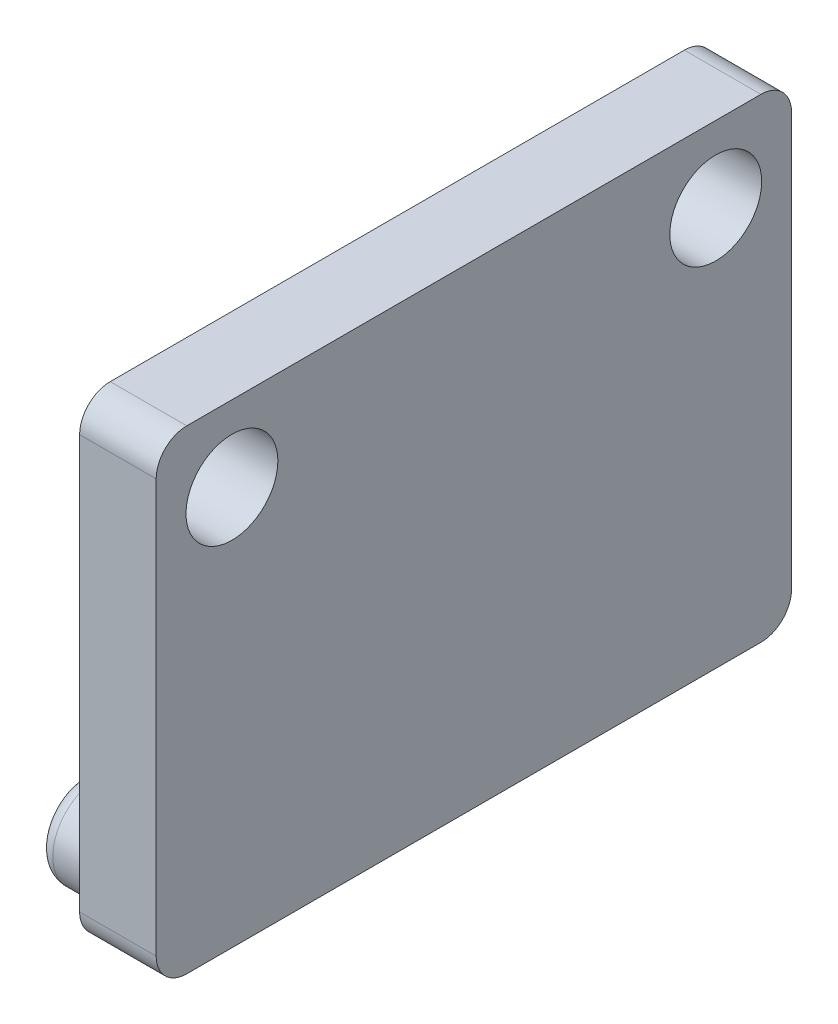
ISO-10303-21;
HEADER;
FILE_DESCRIPTION(('STEP AP214'),'2;1');
FILE_NAME('part.step','',(''),(''),'','','');
FILE_SCHEMA(('AUTOMOTIVE_DESIGN { 1 0 10303 214 1 1 1 1 }'));
ENDSEC;
DATA;
#1=APPLICATION_CONTEXT('core data for automotive mechanical design processes');
#2=APPLICATION_PROTOCOL_DEFINITION('international standard','automotive_design',2000,#1);
#3=PRODUCT_CONTEXT('',#1,'mechanical');
#4=PRODUCT('Part','Part','',(#3));
#5=PRODUCT_RELATED_PRODUCT_CATEGORY('part','',(#4));
#6=PRODUCT_DEFINITION_FORMATION('','',#4);
#7=PRODUCT_DEFINITION_CONTEXT('part definition',#1,'design');
#8=PRODUCT_DEFINITION('design','',#6,#7);
#9=PRODUCT_DEFINITION_SHAPE('','',#8);
#10=(LENGTH_UNIT() NAMED_UNIT(*) SI_UNIT(.MILLI.,.METRE.));
#11=(NAMED_UNIT(*) PLANE_ANGLE_UNIT() SI_UNIT($,.RADIAN.));
#12=(NAMED_UNIT(*) SI_UNIT($,.STERADIAN.) SOLID_ANGLE_UNIT());
#13=UNCERTAINTY_MEASURE_WITH_UNIT(LENGTH_MEASURE(1.E-05),#10,'distance_accuracy_value','');
#14=(GEOMETRIC_REPRESENTATION_CONTEXT(3) GLOBAL_UNCERTAINTY_ASSIGNED_CONTEXT((#13)) GLOBAL_UNIT_ASSIGNED_CONTEXT((#10,
#11,#12)) REPRESENTATION_CONTEXT('',''));
#15=CARTESIAN_POINT('',(0.,0.,0.));
#16=DIRECTION('',(0.,0.,1.));
#17=DIRECTION('',(1.,0.,0.));
#18=AXIS2_PLACEMENT_3D('',#15,#16,#17);
#19=CARTESIAN_POINT('',(6.865625,0.,0.));
#20=DIRECTION('',(-1.,0.,0.));
#21=DIRECTION('',(0.,0.,1.));
#22=AXIS2_PLACEMENT_3D('',#19,#20,#21);
#23=PLANE('',#22);
#24=DIRECTION('',(0.,0.,1.));
#25=VECTOR('',#24,1.);
#26=CARTESIAN_POINT('',(6.865625,-38.525,105.8));
#27=LINE('',#26,#25);
#28=CARTESIAN_POINT('',(6.865625,-38.525,86.05));
#29=VERTEX_POINT('',#28);
#30=CARTESIAN_POINT('',(6.865625,-38.525,104.8));
#31=VERTEX_POINT('',#30);
#32=EDGE_CURVE('E580',#29,#31,#27,.T.);
#33=ORIENTED_EDGE('',*,*,#32,.T.);
#34=CARTESIAN_POINT('',(6.865625,-39.525,104.8));
#35=DIRECTION('',(-1.,0.,0.));
#36=DIRECTION('',(0.,0.,1.));
#37=AXIS2_PLACEMENT_3D('',#34,#35,#36);
#38=CIRCLE('',#37,1.);
#39=CARTESIAN_POINT('',(6.865625,-39.525,105.8));
#40=VERTEX_POINT('',#39);
#41=EDGE_CURVE('E603',#31,#40,#38,.F.);
#42=ORIENTED_EDGE('',*,*,#41,.T.);
#43=DIRECTION('',(0.,-1.,0.));
#44=VECTOR('',#43,1.);
#45=CARTESIAN_POINT('',(6.865625,-38.525,105.8));
#46=LINE('',#45,#44);
#47=CARTESIAN_POINT('',(6.865625,-53.025,105.8));
#48=VERTEX_POINT('',#47);
#49=EDGE_CURVE('E551',#40,#48,#46,.T.);
#50=ORIENTED_EDGE('',*,*,#49,.T.);
#51=CARTESIAN_POINT('',(6.865625,-53.025,104.8));
#52=DIRECTION('',(-1.,0.,0.));
#53=DIRECTION('',(0.,0.,1.));
#54=AXIS2_PLACEMENT_3D('',#51,#52,#53);
#55=CIRCLE('',#54,1.);
#56=CARTESIAN_POINT('',(6.865625,-54.025,104.8));
#57=VERTEX_POINT('',#56);
#58=EDGE_CURVE('E591',#48,#57,#55,.F.);
#59=ORIENTED_EDGE('',*,*,#58,.T.);
#60=DIRECTION('',(0.,0.,-1.));
#61=VECTOR('',#60,1.);
#62=CARTESIAN_POINT('',(6.865625,-54.025,105.8));
#63=LINE('',#62,#61);
#64=CARTESIAN_POINT('',(6.865625,-54.025,86.05));
#65=VERTEX_POINT('',#64);
#66=EDGE_CURVE('E803',#57,#65,#63,.T.);
#67=ORIENTED_EDGE('',*,*,#66,.T.);
#68=CARTESIAN_POINT('',(6.865625,-53.025,86.05));
#69=DIRECTION('',(-1.,0.,0.));
#70=DIRECTION('',(0.,0.,1.));
#71=AXIS2_PLACEMENT_3D('',#68,#69,#70);
#72=CIRCLE('',#71,1.);
#73=CARTESIAN_POINT('',(6.865625,-53.025,85.05));
#74=VERTEX_POINT('',#73);
#75=EDGE_CURVE('E487',#65,#74,#72,.F.);
#76=ORIENTED_EDGE('',*,*,#75,.T.);
#77=DIRECTION('',(0.,1.,0.));
#78=VECTOR('',#77,1.);
#79=CARTESIAN_POINT('',(6.865625,-38.525,85.05));
#80=LINE('',#79,#78);
#81=CARTESIAN_POINT('',(6.865625,-39.525,85.05));
#82=VERTEX_POINT('',#81);
#83=EDGE_CURVE('E576',#74,#82,#80,.T.);
#84=ORIENTED_EDGE('',*,*,#83,.T.);
#85=CARTESIAN_POINT('',(6.865625,-39.525,86.05));
#86=DIRECTION('',(-1.,0.,0.));
#87=DIRECTION('',(0.,0.,1.));
#88=AXIS2_PLACEMENT_3D('',#85,#86,#87);
#89=CIRCLE('',#88,1.);
#90=EDGE_CURVE('E596',#82,#29,#89,.F.);
#91=ORIENTED_EDGE('',*,*,#90,.T.);
#92=EDGE_LOOP('',(#33,#42,#50,#59,#67,#76,#84,#91));
#93=FACE_BOUND('',#92,.T.);
#94=CARTESIAN_POINT('',(6.865625,-41.,87.525));
#95=DIRECTION('',(1.,0.,0.));
#96=DIRECTION('',(0.,0.,-1.));
#97=AXIS2_PLACEMENT_3D('',#94,#95,#96);
#98=CIRCLE('',#97,1.5);
#99=CARTESIAN_POINT('',(6.865625,-41.,86.025));
#100=VERTEX_POINT('',#99);
#101=EDGE_CURVE('E571',#100,#100,#98,.T.);
#102=ORIENTED_EDGE('',*,*,#101,.F.);
#103=EDGE_LOOP('',(#102));
#104=FACE_BOUND('',#103,.T.);
#105=CARTESIAN_POINT('',(6.865625,-41.,103.325));
#106=DIRECTION('',(1.,0.,0.));
#107=DIRECTION('',(0.,0.,-1.));
#108=AXIS2_PLACEMENT_3D('',#105,#106,#107);
#109=CIRCLE('',#108,1.5);
#110=CARTESIAN_POINT('',(6.865625,-41.,101.825));
#111=VERTEX_POINT('',#110);
#112=EDGE_CURVE('E784',#111,#111,#109,.T.);
#113=ORIENTED_EDGE('',*,*,#112,.F.);
#114=EDGE_LOOP('',(#113));
#115=FACE_BOUND('',#114,.T.);
#116=ADVANCED_FACE('F462',(#93,#104,#115),#23,.F.);
#117=CARTESIAN_POINT('',(4.365625,0.,0.));
#118=DIRECTION('',(-1.,0.,0.));
#119=DIRECTION('',(0.,0.,1.));
#120=AXIS2_PLACEMENT_3D('',#117,#118,#119);
#121=PLANE('',#120);
#122=CARTESIAN_POINT('',(4.365625,-52.025,104.175));
#123=DIRECTION('',(-1.,0.,0.));
#124=DIRECTION('',(0.,0.,1.));
#125=AXIS2_PLACEMENT_3D('',#122,#123,#124);
#126=CIRCLE('',#125,1.5);
#127=CARTESIAN_POINT('',(4.365625,-52.025,105.675));
#128=VERTEX_POINT('',#127);
#129=EDGE_CURVE('E621',#128,#128,#126,.T.);
#130=ORIENTED_EDGE('',*,*,#129,.F.);
#131=EDGE_LOOP('',(#130));
#132=FACE_BOUND('',#131,.T.);
#133=CARTESIAN_POINT('',(4.365625,-52.025,100.675));
#134=DIRECTION('',(-1.,0.,0.));
#135=DIRECTION('',(0.,0.,1.));
#136=AXIS2_PLACEMENT_3D('',#133,#134,#135);
#137=CIRCLE('',#136,1.5);
#138=CARTESIAN_POINT('',(4.365625,-52.025,102.175));
#139=VERTEX_POINT('',#138);
#140=EDGE_CURVE('E860',#139,#139,#137,.T.);
#141=ORIENTED_EDGE('',*,*,#140,.F.);
#142=EDGE_LOOP('',(#141));
#143=FACE_BOUND('',#142,.T.);
#144=CARTESIAN_POINT('',(4.365625,-52.025,97.175));
#145=DIRECTION('',(-1.,0.,0.));
#146=DIRECTION('',(0.,0.,1.));
#147=AXIS2_PLACEMENT_3D('',#144,#145,#146);
#148=CIRCLE('',#147,1.5);
#149=CARTESIAN_POINT('',(4.365625,-52.025,98.675));
#150=VERTEX_POINT('',#149);
#151=EDGE_CURVE('E855',#150,#150,#148,.T.);
#152=ORIENTED_EDGE('',*,*,#151,.F.);
#153=EDGE_LOOP('',(#152));
#154=FACE_BOUND('',#153,.T.);
#155=CARTESIAN_POINT('',(4.365625,-52.025,93.675));
#156=DIRECTION('',(-1.,0.,0.));
#157=DIRECTION('',(0.,0.,1.));
#158=AXIS2_PLACEMENT_3D('',#155,#156,#157);
#159=CIRCLE('',#158,1.5);
#160=CARTESIAN_POINT('',(4.365625,-52.025,95.175));
#161=VERTEX_POINT('',#160);
#162=EDGE_CURVE('E850',#161,#161,#159,.T.);
#163=ORIENTED_EDGE('',*,*,#162,.F.);
#164=EDGE_LOOP('',(#163));
#165=FACE_BOUND('',#164,.T.);
#166=CARTESIAN_POINT('',(4.365625,-52.025,90.175));
#167=DIRECTION('',(-1.,0.,0.));
#168=DIRECTION('',(0.,0.,1.));
#169=AXIS2_PLACEMENT_3D('',#166,#167,#168);
#170=CIRCLE('',#169,1.5);
#171=CARTESIAN_POINT('',(4.365625,-52.025,91.675));
#172=VERTEX_POINT('',#171);
#173=EDGE_CURVE('E841',#172,#172,#170,.T.);
#174=ORIENTED_EDGE('',*,*,#173,.F.);
#175=EDGE_LOOP('',(#174));
#176=FACE_BOUND('',#175,.T.);
#177=CARTESIAN_POINT('',(4.365625,-52.025,86.675));
#178=DIRECTION('',(-1.,0.,0.));
#179=DIRECTION('',(0.,0.,1.));
#180=AXIS2_PLACEMENT_3D('',#177,#178,#179);
#181=CIRCLE('',#180,1.5);
#182=CARTESIAN_POINT('',(4.365625,-52.025,88.175));
#183=VERTEX_POINT('',#182);
#184=EDGE_CURVE('E617',#183,#183,#181,.T.);
#185=ORIENTED_EDGE('',*,*,#184,.F.);
#186=EDGE_LOOP('',(#185));
#187=FACE_BOUND('',#186,.T.);
#188=CARTESIAN_POINT('',(4.365625,-41.,87.525));
#189=DIRECTION('',(1.,0.,0.));
#190=DIRECTION('',(0.,0.,-1.));
#191=AXIS2_PLACEMENT_3D('',#188,#189,#190);
#192=CIRCLE('',#191,1.5);
#193=CARTESIAN_POINT('',(4.365625,-41.,86.025));
#194=VERTEX_POINT('',#193);
#195=EDGE_CURVE('E792',#194,#194,#192,.T.);
#196=ORIENTED_EDGE('',*,*,#195,.T.);
#197=EDGE_LOOP('',(#196));
#198=FACE_BOUND('',#197,.T.);
#199=DIRECTION('',(0.,-1.,0.));
#200=VECTOR('',#199,1.);
#201=CARTESIAN_POINT('',(4.365625,-38.525,105.8));
#202=LINE('',#201,#200);
#203=CARTESIAN_POINT('',(4.365625,-39.525,105.8));
#204=VERTEX_POINT('',#203);
#205=CARTESIAN_POINT('',(4.365625,-53.025,105.8));
#206=VERTEX_POINT('',#205);
#207=EDGE_CURVE('E549',#204,#206,#202,.T.);
#208=ORIENTED_EDGE('',*,*,#207,.F.);
#209=CARTESIAN_POINT('',(4.365625,-39.525,104.8));
#210=DIRECTION('',(-1.,0.,0.));
#211=DIRECTION('',(0.,0.,1.));
#212=AXIS2_PLACEMENT_3D('',#209,#210,#211);
#213=CIRCLE('',#212,1.);
#214=CARTESIAN_POINT('',(4.365625,-38.525,104.8));
#215=VERTEX_POINT('',#214);
#216=EDGE_CURVE('E535',#204,#215,#213,.T.);
#217=ORIENTED_EDGE('',*,*,#216,.T.);
#218=DIRECTION('',(0.,0.,1.));
#219=VECTOR('',#218,1.);
#220=CARTESIAN_POINT('',(4.365625,-38.525,105.8));
#221=LINE('',#220,#219);
#222=CARTESIAN_POINT('',(4.365625,-38.525,86.05));
#223=VERTEX_POINT('',#222);
#224=EDGE_CURVE('E563',#223,#215,#221,.T.);
#225=ORIENTED_EDGE('',*,*,#224,.F.);
#226=CARTESIAN_POINT('',(4.365625,-39.525,86.05));
#227=DIRECTION('',(-1.,0.,0.));
#228=DIRECTION('',(0.,0.,1.));
#229=AXIS2_PLACEMENT_3D('',#226,#227,#228);
#230=CIRCLE('',#229,1.);
#231=CARTESIAN_POINT('',(4.365625,-39.525,85.05));
#232=VERTEX_POINT('',#231);
#233=EDGE_CURVE('E541',#223,#232,#230,.T.);
#234=ORIENTED_EDGE('',*,*,#233,.T.);
#235=DIRECTION('',(0.,1.,0.));
#236=VECTOR('',#235,1.);
#237=CARTESIAN_POINT('',(4.365625,-38.525,85.05));
#238=LINE('',#237,#236);
#239=CARTESIAN_POINT('',(4.365625,-53.025,85.05));
#240=VERTEX_POINT('',#239);
#241=EDGE_CURVE('E567',#240,#232,#238,.T.);
#242=ORIENTED_EDGE('',*,*,#241,.F.);
#243=CARTESIAN_POINT('',(4.365625,-53.025,86.05));
#244=DIRECTION('',(-1.,0.,0.));
#245=DIRECTION('',(0.,0.,1.));
#246=AXIS2_PLACEMENT_3D('',#243,#244,#245);
#247=CIRCLE('',#246,1.);
#248=CARTESIAN_POINT('',(4.365625,-54.025,86.05));
#249=VERTEX_POINT('',#248);
#250=EDGE_CURVE('E581',#240,#249,#247,.T.);
#251=ORIENTED_EDGE('',*,*,#250,.T.);
#252=DIRECTION('',(0.,0.,-1.));
#253=VECTOR('',#252,1.);
#254=CARTESIAN_POINT('',(4.365625,-54.025,105.8));
#255=LINE('',#254,#253);
#256=CARTESIAN_POINT('',(4.365625,-54.025,104.8));
#257=VERTEX_POINT('',#256);
#258=EDGE_CURVE('E565',#257,#249,#255,.T.);
#259=ORIENTED_EDGE('',*,*,#258,.F.);
#260=CARTESIAN_POINT('',(4.365625,-53.025,104.8));
#261=DIRECTION('',(-1.,0.,0.));
#262=DIRECTION('',(0.,0.,1.));
#263=AXIS2_PLACEMENT_3D('',#260,#261,#262);
#264=CIRCLE('',#263,1.);
#265=EDGE_CURVE('E554',#257,#206,#264,.T.);
#266=ORIENTED_EDGE('',*,*,#265,.T.);
#267=EDGE_LOOP('',(#208,#217,#225,#234,#242,#251,#259,#266));
#268=FACE_BOUND('',#267,.T.);
#269=CARTESIAN_POINT('',(4.365625,-41.,103.325));
#270=DIRECTION('',(1.,0.,0.));
#271=DIRECTION('',(0.,0.,-1.));
#272=AXIS2_PLACEMENT_3D('',#269,#270,#271);
#273=CIRCLE('',#272,1.5);
#274=CARTESIAN_POINT('',(4.365625,-41.,101.825));
#275=VERTEX_POINT('',#274);
#276=EDGE_CURVE('E788',#275,#275,#273,.T.);
#277=ORIENTED_EDGE('',*,*,#276,.T.);
#278=EDGE_LOOP('',(#277));
#279=FACE_BOUND('',#278,.T.);
#280=ADVANCED_FACE('F556',(#132,#143,#154,#165,#176,#187,#198,#268,#279),#121,.T.);
#281=CARTESIAN_POINT('',(6.865625,-38.525,105.8));
#282=DIRECTION('',(0.,-1.,0.));
#283=DIRECTION('',(0.,0.,-1.));
#284=AXIS2_PLACEMENT_3D('',#281,#282,#283);
#285=PLANE('',#284);
#286=ORIENTED_EDGE('',*,*,#224,.T.);
#287=DIRECTION('',(-1.,0.,0.));
#288=VECTOR('',#287,1.);
#289=CARTESIAN_POINT('',(6.865625,-38.525,104.8));
#290=LINE('',#289,#288);
#291=EDGE_CURVE('E540',#215,#31,#290,.F.);
#292=ORIENTED_EDGE('',*,*,#291,.T.);
#293=ORIENTED_EDGE('',*,*,#32,.F.);
#294=DIRECTION('',(-1.,0.,0.));
#295=VECTOR('',#294,1.);
#296=CARTESIAN_POINT('',(6.865625,-38.525,86.05));
#297=LINE('',#296,#295);
#298=EDGE_CURVE('E544',#29,#223,#297,.T.);
#299=ORIENTED_EDGE('',*,*,#298,.T.);
#300=EDGE_LOOP('',(#286,#292,#293,#299));
#301=FACE_BOUND('',#300,.T.);
#302=ADVANCED_FACE('F683',(#301),#285,.F.);
#303=CARTESIAN_POINT('',(6.865625,-38.525,105.8));
#304=DIRECTION('',(0.,0.,-1.));
#305=DIRECTION('',(0.,1.,0.));
#306=AXIS2_PLACEMENT_3D('',#303,#304,#305);
#307=PLANE('',#306);
#308=ORIENTED_EDGE('',*,*,#49,.F.);
#309=DIRECTION('',(-1.,0.,0.));
#310=VECTOR('',#309,1.);
#311=CARTESIAN_POINT('',(6.865625,-39.525,105.8));
#312=LINE('',#311,#310);
#313=EDGE_CURVE('E538',#40,#204,#312,.T.);
#314=ORIENTED_EDGE('',*,*,#313,.T.);
#315=ORIENTED_EDGE('',*,*,#207,.T.);
#316=DIRECTION('',(-1.,0.,0.));
#317=VECTOR('',#316,1.);
#318=CARTESIAN_POINT('',(6.865625,-53.025,105.8));
#319=LINE('',#318,#317);
#320=EDGE_CURVE('E558',#206,#48,#319,.F.);
#321=ORIENTED_EDGE('',*,*,#320,.T.);
#322=EDGE_LOOP('',(#308,#314,#315,#321));
#323=FACE_BOUND('',#322,.T.);
#324=ADVANCED_FACE('F547',(#323),#307,.F.);
#325=CARTESIAN_POINT('',(6.865625,-54.025,105.8));
#326=DIRECTION('',(0.,1.,0.));
#327=DIRECTION('',(0.,0.,1.));
#328=AXIS2_PLACEMENT_3D('',#325,#326,#327);
#329=PLANE('',#328);
#330=ORIENTED_EDGE('',*,*,#258,.T.);
#331=DIRECTION('',(-1.,0.,0.));
#332=VECTOR('',#331,1.);
#333=CARTESIAN_POINT('',(6.865625,-54.025,86.05));
#334=LINE('',#333,#332);
#335=EDGE_CURVE('E612',#249,#65,#334,.F.);
#336=ORIENTED_EDGE('',*,*,#335,.T.);
#337=ORIENTED_EDGE('',*,*,#66,.F.);
#338=DIRECTION('',(-1.,0.,0.));
#339=VECTOR('',#338,1.);
#340=CARTESIAN_POINT('',(6.865625,-54.025,104.8));
#341=LINE('',#340,#339);
#342=EDGE_CURVE('E608',#57,#257,#341,.T.);
#343=ORIENTED_EDGE('',*,*,#342,.T.);
#344=EDGE_LOOP('',(#330,#336,#337,#343));
#345=FACE_BOUND('',#344,.T.);
#346=ADVANCED_FACE('F693',(#345),#329,.F.);
#347=CARTESIAN_POINT('',(6.865625,-38.525,85.05));
#348=DIRECTION('',(0.,0.,1.));
#349=DIRECTION('',(1.,0.,0.));
#350=AXIS2_PLACEMENT_3D('',#347,#348,#349);
#351=PLANE('',#350);
#352=ORIENTED_EDGE('',*,*,#241,.T.);
#353=DIRECTION('',(-1.,0.,0.));
#354=VECTOR('',#353,1.);
#355=CARTESIAN_POINT('',(6.865625,-39.525,85.05));
#356=LINE('',#355,#354);
#357=EDGE_CURVE('E478',#232,#82,#356,.F.);
#358=ORIENTED_EDGE('',*,*,#357,.T.);
#359=ORIENTED_EDGE('',*,*,#83,.F.);
#360=DIRECTION('',(-1.,0.,0.));
#361=VECTOR('',#360,1.);
#362=CARTESIAN_POINT('',(6.865625,-53.025,85.05));
#363=LINE('',#362,#361);
#364=EDGE_CURVE('E602',#74,#240,#363,.T.);
#365=ORIENTED_EDGE('',*,*,#364,.T.);
#366=EDGE_LOOP('',(#352,#358,#359,#365));
#367=FACE_BOUND('',#366,.T.);
#368=ADVANCED_FACE('F687',(#367),#351,.F.);
#369=CARTESIAN_POINT('',(6.865625,-41.,87.525));
#370=DIRECTION('',(-1.,0.,0.));
#371=DIRECTION('',(0.,0.,1.));
#372=AXIS2_PLACEMENT_3D('',#369,#370,#371);
#373=CYLINDRICAL_SURFACE('',#372,1.5);
#374=ORIENTED_EDGE('',*,*,#101,.T.);
#375=EDGE_LOOP('',(#374));
#376=FACE_BOUND('',#375,.T.);
#377=ORIENTED_EDGE('',*,*,#195,.F.);
#378=EDGE_LOOP('',(#377));
#379=FACE_BOUND('',#378,.T.);
#380=ADVANCED_FACE('F690',(#376,#379),#373,.F.);
#381=CARTESIAN_POINT('',(6.865625,-41.,103.325));
#382=DIRECTION('',(-1.,0.,0.));
#383=DIRECTION('',(0.,0.,1.));
#384=AXIS2_PLACEMENT_3D('',#381,#382,#383);
#385=CYLINDRICAL_SURFACE('',#384,1.5);
#386=ORIENTED_EDGE('',*,*,#112,.T.);
#387=EDGE_LOOP('',(#386));
#388=FACE_BOUND('',#387,.T.);
#389=ORIENTED_EDGE('',*,*,#276,.F.);
#390=EDGE_LOOP('',(#389));
#391=FACE_BOUND('',#390,.T.);
#392=ADVANCED_FACE('F703',(#388,#391),#385,.F.);
#393=CARTESIAN_POINT('',(6.865625,-39.525,104.8));
#394=DIRECTION('',(-1.,0.,0.));
#395=DIRECTION('',(0.,0.,1.));
#396=AXIS2_PLACEMENT_3D('',#393,#394,#395);
#397=CYLINDRICAL_SURFACE('',#396,1.);
#398=ORIENTED_EDGE('',*,*,#41,.F.);
#399=ORIENTED_EDGE('',*,*,#291,.F.);
#400=ORIENTED_EDGE('',*,*,#216,.F.);
#401=ORIENTED_EDGE('',*,*,#313,.F.);
#402=EDGE_LOOP('',(#398,#399,#400,#401));
#403=FACE_BOUND('',#402,.T.);
#404=ADVANCED_FACE('F533',(#403),#397,.T.);
#405=CARTESIAN_POINT('',(6.865625,-39.525,86.05));
#406=DIRECTION('',(-1.,0.,0.));
#407=DIRECTION('',(0.,0.,1.));
#408=AXIS2_PLACEMENT_3D('',#405,#406,#407);
#409=CYLINDRICAL_SURFACE('',#408,1.);
#410=ORIENTED_EDGE('',*,*,#90,.F.);
#411=ORIENTED_EDGE('',*,*,#357,.F.);
#412=ORIENTED_EDGE('',*,*,#233,.F.);
#413=ORIENTED_EDGE('',*,*,#298,.F.);
#414=EDGE_LOOP('',(#410,#411,#412,#413));
#415=FACE_BOUND('',#414,.T.);
#416=ADVANCED_FACE('F702',(#415),#409,.T.);
#417=CARTESIAN_POINT('',(6.865625,-53.025,86.05));
#418=DIRECTION('',(-1.,0.,0.));
#419=DIRECTION('',(0.,0.,1.));
#420=AXIS2_PLACEMENT_3D('',#417,#418,#419);
#421=CYLINDRICAL_SURFACE('',#420,1.);
#422=ORIENTED_EDGE('',*,*,#75,.F.);
#423=ORIENTED_EDGE('',*,*,#335,.F.);
#424=ORIENTED_EDGE('',*,*,#250,.F.);
#425=ORIENTED_EDGE('',*,*,#364,.F.);
#426=EDGE_LOOP('',(#422,#423,#424,#425));
#427=FACE_BOUND('',#426,.T.);
#428=ADVANCED_FACE('F710',(#427),#421,.T.);
#429=CARTESIAN_POINT('',(6.865625,-53.025,104.8));
#430=DIRECTION('',(-1.,0.,0.));
#431=DIRECTION('',(0.,0.,1.));
#432=AXIS2_PLACEMENT_3D('',#429,#430,#431);
#433=CYLINDRICAL_SURFACE('',#432,1.);
#434=ORIENTED_EDGE('',*,*,#58,.F.);
#435=ORIENTED_EDGE('',*,*,#320,.F.);
#436=ORIENTED_EDGE('',*,*,#265,.F.);
#437=ORIENTED_EDGE('',*,*,#342,.F.);
#438=EDGE_LOOP('',(#434,#435,#436,#437));
#439=FACE_BOUND('',#438,.T.);
#440=ADVANCED_FACE('F713',(#439),#433,.T.);
#441=CARTESIAN_POINT('',(2.865625,-52.025,86.675));
#442=DIRECTION('',(1.,0.,0.));
#443=DIRECTION('',(0.,0.,-1.));
#444=AXIS2_PLACEMENT_3D('',#441,#442,#443);
#445=CYLINDRICAL_SURFACE('',#444,1.5);
#446=CARTESIAN_POINT('',(3.365625,-52.025,86.675));
#447=DIRECTION('',(-1.,0.,0.));
#448=DIRECTION('',(0.,0.,1.));
#449=AXIS2_PLACEMENT_3D('',#446,#447,#448);
#450=CIRCLE('',#449,1.5);
#451=CARTESIAN_POINT('',(3.365625,-52.025,88.175));
#452=VERTEX_POINT('',#451);
#453=EDGE_CURVE('E625',#452,#452,#450,.F.);
#454=ORIENTED_EDGE('',*,*,#453,.T.);
#455=EDGE_LOOP('',(#454));
#456=FACE_BOUND('',#455,.T.);
#457=ORIENTED_EDGE('',*,*,#184,.T.);
#458=EDGE_LOOP('',(#457));
#459=FACE_BOUND('',#458,.T.);
#460=ADVANCED_FACE('F714',(#456,#459),#445,.T.);
#461=CARTESIAN_POINT('',(2.865625,-52.025,86.675));
#462=DIRECTION('',(-1.,0.,0.));
#463=DIRECTION('',(0.,0.,1.));
#464=AXIS2_PLACEMENT_3D('',#461,#462,#463);
#465=PLANE('',#464);
#466=CARTESIAN_POINT('',(2.865625,-52.025,86.675));
#467=DIRECTION('',(-1.,0.,0.));
#468=DIRECTION('',(0.,0.,1.));
#469=AXIS2_PLACEMENT_3D('',#466,#467,#468);
#470=CIRCLE('',#469,1.);
#471=CARTESIAN_POINT('',(2.865625,-52.025,87.675));
#472=VERTEX_POINT('',#471);
#473=EDGE_CURVE('E616',#472,#472,#470,.T.);
#474=ORIENTED_EDGE('',*,*,#473,.T.);
#475=EDGE_LOOP('',(#474));
#476=FACE_BOUND('',#475,.T.);
#477=ADVANCED_FACE('F764',(#476),#465,.T.);
#478=CARTESIAN_POINT('',(2.865625,-52.025,90.175));
#479=DIRECTION('',(1.,0.,0.));
#480=DIRECTION('',(0.,0.,-1.));
#481=AXIS2_PLACEMENT_3D('',#478,#479,#480);
#482=CYLINDRICAL_SURFACE('',#481,1.5);
#483=CARTESIAN_POINT('',(3.365625,-52.025,90.175));
#484=DIRECTION('',(-1.,0.,0.));
#485=DIRECTION('',(0.,0.,1.));
#486=AXIS2_PLACEMENT_3D('',#483,#484,#485);
#487=CIRCLE('',#486,1.5);
#488=CARTESIAN_POINT('',(3.365625,-52.025,91.675));
#489=VERTEX_POINT('',#488);
#490=EDGE_CURVE('E631',#489,#489,#487,.F.);
#491=ORIENTED_EDGE('',*,*,#490,.T.);
#492=EDGE_LOOP('',(#491));
#493=FACE_BOUND('',#492,.T.);
#494=ORIENTED_EDGE('',*,*,#173,.T.);
#495=EDGE_LOOP('',(#494));
#496=FACE_BOUND('',#495,.T.);
#497=ADVANCED_FACE('F765',(#493,#496),#482,.T.);
#498=CARTESIAN_POINT('',(2.865625,-52.025,90.175));
#499=DIRECTION('',(-1.,0.,0.));
#500=DIRECTION('',(0.,0.,1.));
#501=AXIS2_PLACEMENT_3D('',#498,#499,#500);
#502=PLANE('',#501);
#503=CARTESIAN_POINT('',(2.865625,-52.025,90.175));
#504=DIRECTION('',(-1.,0.,0.));
#505=DIRECTION('',(0.,0.,1.));
#506=AXIS2_PLACEMENT_3D('',#503,#504,#505);
#507=CIRCLE('',#506,1.);
#508=CARTESIAN_POINT('',(2.865625,-52.025,91.175));
#509=VERTEX_POINT('',#508);
#510=EDGE_CURVE('E630',#509,#509,#507,.T.);
#511=ORIENTED_EDGE('',*,*,#510,.T.);
#512=EDGE_LOOP('',(#511));
#513=FACE_BOUND('',#512,.T.);
#514=ADVANCED_FACE('F760',(#513),#502,.T.);
#515=CARTESIAN_POINT('',(2.865625,-52.025,93.675));
#516=DIRECTION('',(1.,0.,0.));
#517=DIRECTION('',(0.,0.,-1.));
#518=AXIS2_PLACEMENT_3D('',#515,#516,#517);
#519=CYLINDRICAL_SURFACE('',#518,1.5);
#520=CARTESIAN_POINT('',(3.365625,-52.025,93.675));
#521=DIRECTION('',(-1.,0.,0.));
#522=DIRECTION('',(0.,0.,1.));
#523=AXIS2_PLACEMENT_3D('',#520,#521,#522);
#524=CIRCLE('',#523,1.5);
#525=CARTESIAN_POINT('',(3.365625,-52.025,95.175));
#526=VERTEX_POINT('',#525);
#527=EDGE_CURVE('E638',#526,#526,#524,.F.);
#528=ORIENTED_EDGE('',*,*,#527,.T.);
#529=EDGE_LOOP('',(#528));
#530=FACE_BOUND('',#529,.T.);
#531=ORIENTED_EDGE('',*,*,#162,.T.);
#532=EDGE_LOOP('',(#531));
#533=FACE_BOUND('',#532,.T.);
#534=ADVANCED_FACE('F754',(#530,#533),#519,.T.);
#535=CARTESIAN_POINT('',(2.865625,-52.025,93.675));
#536=DIRECTION('',(-1.,0.,0.));
#537=DIRECTION('',(0.,0.,1.));
#538=AXIS2_PLACEMENT_3D('',#535,#536,#537);
#539=PLANE('',#538);
#540=CARTESIAN_POINT('',(2.865625,-52.025,93.675));
#541=DIRECTION('',(-1.,0.,0.));
#542=DIRECTION('',(0.,0.,1.));
#543=AXIS2_PLACEMENT_3D('',#540,#541,#542);
#544=CIRCLE('',#543,1.);
#545=CARTESIAN_POINT('',(2.865625,-52.025,94.675));
#546=VERTEX_POINT('',#545);
#547=EDGE_CURVE('E634',#546,#546,#544,.T.);
#548=ORIENTED_EDGE('',*,*,#547,.T.);
#549=EDGE_LOOP('',(#548));
#550=FACE_BOUND('',#549,.T.);
#551=ADVANCED_FACE('F750',(#550),#539,.T.);
#552=CARTESIAN_POINT('',(2.865625,-52.025,97.175));
#553=DIRECTION('',(1.,0.,0.));
#554=DIRECTION('',(0.,0.,-1.));
#555=AXIS2_PLACEMENT_3D('',#552,#553,#554);
#556=CYLINDRICAL_SURFACE('',#555,1.5);
#557=CARTESIAN_POINT('',(3.365625,-52.025,97.175));
#558=DIRECTION('',(-1.,0.,0.));
#559=DIRECTION('',(0.,0.,1.));
#560=AXIS2_PLACEMENT_3D('',#557,#558,#559);
#561=CIRCLE('',#560,1.5);
#562=CARTESIAN_POINT('',(3.365625,-52.025,98.675));
#563=VERTEX_POINT('',#562);
#564=EDGE_CURVE('E650',#563,#563,#561,.F.);
#565=ORIENTED_EDGE('',*,*,#564,.T.);
#566=EDGE_LOOP('',(#565));
#567=FACE_BOUND('',#566,.T.);
#568=ORIENTED_EDGE('',*,*,#151,.T.);
#569=EDGE_LOOP('',(#568));
#570=FACE_BOUND('',#569,.T.);
#571=ADVANCED_FACE('F738',(#567,#570),#556,.T.);
#572=CARTESIAN_POINT('',(2.865625,-52.025,97.175));
#573=DIRECTION('',(-1.,0.,0.));
#574=DIRECTION('',(0.,0.,1.));
#575=AXIS2_PLACEMENT_3D('',#572,#573,#574);
#576=PLANE('',#575);
#577=CARTESIAN_POINT('',(2.865625,-52.025,97.175));
#578=DIRECTION('',(-1.,0.,0.));
#579=DIRECTION('',(0.,0.,1.));
#580=AXIS2_PLACEMENT_3D('',#577,#578,#579);
#581=CIRCLE('',#580,1.);
#582=CARTESIAN_POINT('',(2.865625,-52.025,98.175));
#583=VERTEX_POINT('',#582);
#584=EDGE_CURVE('E644',#583,#583,#581,.T.);
#585=ORIENTED_EDGE('',*,*,#584,.T.);
#586=EDGE_LOOP('',(#585));
#587=FACE_BOUND('',#586,.T.);
#588=ADVANCED_FACE('F740',(#587),#576,.T.);
#589=CARTESIAN_POINT('',(2.865625,-52.025,100.675));
#590=DIRECTION('',(1.,0.,0.));
#591=DIRECTION('',(0.,0.,-1.));
#592=AXIS2_PLACEMENT_3D('',#589,#590,#591);
#593=CYLINDRICAL_SURFACE('',#592,1.5);
#594=CARTESIAN_POINT('',(3.365625,-52.025,100.675));
#595=DIRECTION('',(-1.,0.,0.));
#596=DIRECTION('',(0.,0.,1.));
#597=AXIS2_PLACEMENT_3D('',#594,#595,#596);
#598=CIRCLE('',#597,1.5);
#599=CARTESIAN_POINT('',(3.365625,-52.025,102.175));
#600=VERTEX_POINT('',#599);
#601=EDGE_CURVE('E653',#600,#600,#598,.F.);
#602=ORIENTED_EDGE('',*,*,#601,.T.);
#603=EDGE_LOOP('',(#602));
#604=FACE_BOUND('',#603,.T.);
#605=ORIENTED_EDGE('',*,*,#140,.T.);
#606=EDGE_LOOP('',(#605));
#607=FACE_BOUND('',#606,.T.);
#608=ADVANCED_FACE('F736',(#604,#607),#593,.T.);
#609=CARTESIAN_POINT('',(2.865625,-52.025,100.675));
#610=DIRECTION('',(-1.,0.,0.));
#611=DIRECTION('',(0.,0.,1.));
#612=AXIS2_PLACEMENT_3D('',#609,#610,#611);
#613=PLANE('',#612);
#614=CARTESIAN_POINT('',(2.865625,-52.025,100.675));
#615=DIRECTION('',(-1.,0.,0.));
#616=DIRECTION('',(0.,0.,1.));
#617=AXIS2_PLACEMENT_3D('',#614,#615,#616);
#618=CIRCLE('',#617,1.);
#619=CARTESIAN_POINT('',(2.865625,-52.025,101.675));
#620=VERTEX_POINT('',#619);
#621=EDGE_CURVE('E652',#620,#620,#618,.T.);
#622=ORIENTED_EDGE('',*,*,#621,.T.);
#623=EDGE_LOOP('',(#622));
#624=FACE_BOUND('',#623,.T.);
#625=ADVANCED_FACE('F748',(#624),#613,.T.);
#626=CARTESIAN_POINT('',(2.865625,-52.025,104.175));
#627=DIRECTION('',(1.,0.,0.));
#628=DIRECTION('',(0.,0.,-1.));
#629=AXIS2_PLACEMENT_3D('',#626,#627,#628);
#630=CYLINDRICAL_SURFACE('',#629,1.5);
#631=CARTESIAN_POINT('',(3.365625,-52.025,104.175));
#632=DIRECTION('',(-1.,0.,0.));
#633=DIRECTION('',(0.,0.,1.));
#634=AXIS2_PLACEMENT_3D('',#631,#632,#633);
#635=CIRCLE('',#634,1.5);
#636=CARTESIAN_POINT('',(3.365625,-52.025,105.675));
#637=VERTEX_POINT('',#636);
#638=EDGE_CURVE('E12',#637,#637,#635,.F.);
#639=ORIENTED_EDGE('',*,*,#638,.T.);
#640=EDGE_LOOP('',(#639));
#641=FACE_BOUND('',#640,.T.);
#642=ORIENTED_EDGE('',*,*,#129,.T.);
#643=EDGE_LOOP('',(#642));
#644=FACE_BOUND('',#643,.T.);
#645=ADVANCED_FACE('F876',(#641,#644),#630,.T.);
#646=CARTESIAN_POINT('',(2.865625,-52.025,104.175));
#647=DIRECTION('',(-1.,0.,0.));
#648=DIRECTION('',(0.,0.,1.));
#649=AXIS2_PLACEMENT_3D('',#646,#647,#648);
#650=PLANE('',#649);
#651=CARTESIAN_POINT('',(2.865625,-52.025,104.175));
#652=DIRECTION('',(-1.,0.,0.));
#653=DIRECTION('',(0.,0.,1.));
#654=AXIS2_PLACEMENT_3D('',#651,#652,#653);
#655=CIRCLE('',#654,1.);
#656=CARTESIAN_POINT('',(2.865625,-52.025,105.175));
#657=VERTEX_POINT('',#656);
#658=EDGE_CURVE('E471',#657,#657,#655,.T.);
#659=ORIENTED_EDGE('',*,*,#658,.T.);
#660=EDGE_LOOP('',(#659));
#661=FACE_BOUND('',#660,.T.);
#662=ADVANCED_FACE('F661',(#661),#650,.T.);
#663=CARTESIAN_POINT('',(3.365625,-52.025,86.675));
#664=DIRECTION('',(-1.,0.,0.));
#665=DIRECTION('',(0.,0.,1.));
#666=AXIS2_PLACEMENT_3D('',#663,#664,#665);
#667=TOROIDAL_SURFACE('',#666,1.,0.5);
#668=ORIENTED_EDGE('',*,*,#453,.F.);
#669=EDGE_LOOP('',(#668));
#670=FACE_BOUND('',#669,.T.);
#671=ORIENTED_EDGE('',*,*,#473,.F.);
#672=EDGE_LOOP('',(#671));
#673=FACE_BOUND('',#672,.T.);
#674=ADVANCED_FACE('F720',(#670,#673),#667,.T.);
#675=CARTESIAN_POINT('',(3.365625,-52.025,90.175));
#676=DIRECTION('',(-1.,0.,0.));
#677=DIRECTION('',(0.,0.,1.));
#678=AXIS2_PLACEMENT_3D('',#675,#676,#677);
#679=TOROIDAL_SURFACE('',#678,1.,0.5);
#680=ORIENTED_EDGE('',*,*,#490,.F.);
#681=EDGE_LOOP('',(#680));
#682=FACE_BOUND('',#681,.T.);
#683=ORIENTED_EDGE('',*,*,#510,.F.);
#684=EDGE_LOOP('',(#683));
#685=FACE_BOUND('',#684,.T.);
#686=ADVANCED_FACE('F718',(#682,#685),#679,.T.);
#687=CARTESIAN_POINT('',(3.365625,-52.025,93.675));
#688=DIRECTION('',(-1.,0.,0.));
#689=DIRECTION('',(0.,0.,1.));
#690=AXIS2_PLACEMENT_3D('',#687,#688,#689);
#691=TOROIDAL_SURFACE('',#690,1.,0.5);
#692=ORIENTED_EDGE('',*,*,#527,.F.);
#693=EDGE_LOOP('',(#692));
#694=FACE_BOUND('',#693,.T.);
#695=ORIENTED_EDGE('',*,*,#547,.F.);
#696=EDGE_LOOP('',(#695));
#697=FACE_BOUND('',#696,.T.);
#698=ADVANCED_FACE('F722',(#694,#697),#691,.T.);
#699=CARTESIAN_POINT('',(3.365625,-52.025,97.175));
#700=DIRECTION('',(-1.,0.,0.));
#701=DIRECTION('',(0.,0.,1.));
#702=AXIS2_PLACEMENT_3D('',#699,#700,#701);
#703=TOROIDAL_SURFACE('',#702,1.,0.5);
#704=ORIENTED_EDGE('',*,*,#564,.F.);
#705=EDGE_LOOP('',(#704));
#706=FACE_BOUND('',#705,.T.);
#707=ORIENTED_EDGE('',*,*,#584,.F.);
#708=EDGE_LOOP('',(#707));
#709=FACE_BOUND('',#708,.T.);
#710=ADVANCED_FACE('F672',(#706,#709),#703,.T.);
#711=CARTESIAN_POINT('',(3.365625,-52.025,100.675));
#712=DIRECTION('',(-1.,0.,0.));
#713=DIRECTION('',(0.,0.,1.));
#714=AXIS2_PLACEMENT_3D('',#711,#712,#713);
#715=TOROIDAL_SURFACE('',#714,1.,0.5);
#716=ORIENTED_EDGE('',*,*,#601,.F.);
#717=EDGE_LOOP('',(#716));
#718=FACE_BOUND('',#717,.T.);
#719=ORIENTED_EDGE('',*,*,#621,.F.);
#720=EDGE_LOOP('',(#719));
#721=FACE_BOUND('',#720,.T.);
#722=ADVANCED_FACE('F668',(#718,#721),#715,.T.);
#723=CARTESIAN_POINT('',(3.365625,-52.025,104.175));
#724=DIRECTION('',(-1.,0.,0.));
#725=DIRECTION('',(0.,0.,1.));
#726=AXIS2_PLACEMENT_3D('',#723,#724,#725);
#727=TOROIDAL_SURFACE('',#726,1.,0.5);
#728=ORIENTED_EDGE('',*,*,#638,.F.);
#729=EDGE_LOOP('',(#728));
#730=FACE_BOUND('',#729,.T.);
#731=ORIENTED_EDGE('',*,*,#658,.F.);
#732=EDGE_LOOP('',(#731));
#733=FACE_BOUND('',#732,.T.);
#734=ADVANCED_FACE('F467',(#730,#733),#727,.T.);
#735=CLOSED_SHELL('',(#116,#280,#302,#324,#346,#368,#380,#392,#404,#416,#428,#440,#460,#477,
#497,#514,#534,#551,#571,#588,#608,#625,#645,#662,#674,#686,#698,#710,#722,#734));
#736=MANIFOLD_SOLID_BREP('B2',#735);
#737=ADVANCED_BREP_SHAPE_REPRESENTATION('',(#18,#736),#14);
#738=SHAPE_DEFINITION_REPRESENTATION(#9,#737);
ENDSEC;
END-ISO-10303-21;
